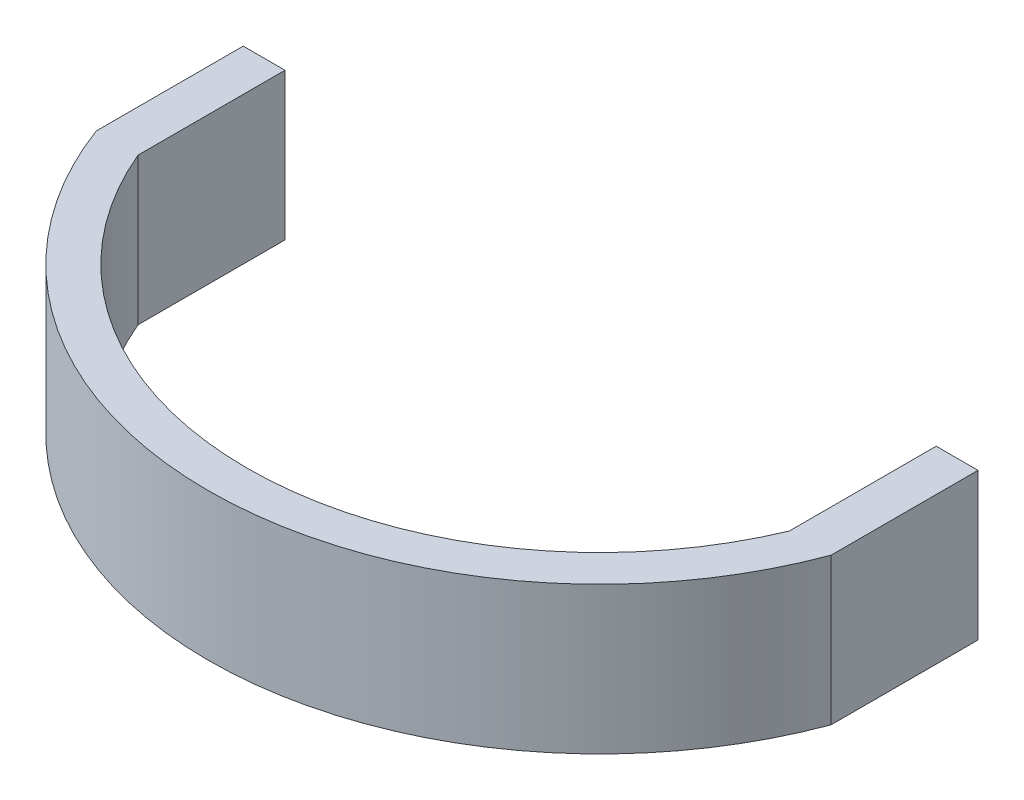
ISO-10303-21;
HEADER;
FILE_DESCRIPTION(('STEP AP214'),'2;1');
FILE_NAME('part.step','',(''),(''),'','','');
FILE_SCHEMA(('AUTOMOTIVE_DESIGN { 1 0 10303 214 1 1 1 1 }'));
ENDSEC;
DATA;
#1=APPLICATION_CONTEXT('core data for automotive mechanical design processes');
#2=APPLICATION_PROTOCOL_DEFINITION('international standard','automotive_design',2000,#1);
#3=PRODUCT_CONTEXT('',#1,'mechanical');
#4=PRODUCT('Part','Part','',(#3));
#5=PRODUCT_RELATED_PRODUCT_CATEGORY('part','',(#4));
#6=PRODUCT_DEFINITION_FORMATION('','',#4);
#7=PRODUCT_DEFINITION_CONTEXT('part definition',#1,'design');
#8=PRODUCT_DEFINITION('design','',#6,#7);
#9=PRODUCT_DEFINITION_SHAPE('','',#8);
#10=(LENGTH_UNIT() NAMED_UNIT(*) SI_UNIT(.MILLI.,.METRE.));
#11=(NAMED_UNIT(*) PLANE_ANGLE_UNIT() SI_UNIT($,.RADIAN.));
#12=(NAMED_UNIT(*) SI_UNIT($,.STERADIAN.) SOLID_ANGLE_UNIT());
#13=UNCERTAINTY_MEASURE_WITH_UNIT(LENGTH_MEASURE(1.E-05),#10,'distance_accuracy_value','');
#14=(GEOMETRIC_REPRESENTATION_CONTEXT(3) GLOBAL_UNCERTAINTY_ASSIGNED_CONTEXT((#13)) GLOBAL_UNIT_ASSIGNED_CONTEXT((#10,
#11,#12)) REPRESENTATION_CONTEXT('',''));
#15=CARTESIAN_POINT('',(0.,0.,0.));
#16=DIRECTION('',(0.,0.,1.));
#17=DIRECTION('',(1.,0.,0.));
#18=AXIS2_PLACEMENT_3D('',#15,#16,#17);
#19=CARTESIAN_POINT('',(0.,1.5,0.));
#20=DIRECTION('',(0.,-1.,0.));
#21=DIRECTION('',(0.,0.,-1.));
#22=AXIS2_PLACEMENT_3D('',#19,#20,#21);
#23=CYLINDRICAL_SURFACE('',#22,8.);
#24=CARTESIAN_POINT('',(0.,-1.5,0.));
#25=DIRECTION('',(0.,1.,0.));
#26=DIRECTION('',(0.,0.,1.));
#27=AXIS2_PLACEMENT_3D('',#24,#25,#26);
#28=CIRCLE('',#27,8.);
#29=CARTESIAN_POINT('',(-7.5,-1.5,2.78388218141501));
#30=VERTEX_POINT('',#29);
#31=CARTESIAN_POINT('',(7.5,-1.5,2.78388218141501));
#32=VERTEX_POINT('',#31);
#33=EDGE_CURVE('E140',#30,#32,#28,.T.);
#34=ORIENTED_EDGE('',*,*,#33,.T.);
#35=DIRECTION('',(0.,-1.,0.));
#36=VECTOR('',#35,1.);
#37=CARTESIAN_POINT('',(7.5,1.5,2.78388218141501));
#38=LINE('',#37,#36);
#39=CARTESIAN_POINT('',(7.5,1.5,2.78388218141501));
#40=VERTEX_POINT('',#39);
#41=EDGE_CURVE('E11',#40,#32,#38,.T.);
#42=ORIENTED_EDGE('',*,*,#41,.F.);
#43=CARTESIAN_POINT('',(0.,1.5,0.));
#44=DIRECTION('',(0.,1.,0.));
#45=DIRECTION('',(0.,0.,1.));
#46=AXIS2_PLACEMENT_3D('',#43,#44,#45);
#47=CIRCLE('',#46,8.);
#48=CARTESIAN_POINT('',(-7.5,1.5,2.78388218141501));
#49=VERTEX_POINT('',#48);
#50=EDGE_CURVE('E162',#49,#40,#47,.T.);
#51=ORIENTED_EDGE('',*,*,#50,.F.);
#52=DIRECTION('',(0.,-1.,0.));
#53=VECTOR('',#52,1.);
#54=CARTESIAN_POINT('',(-7.5,1.5,2.78388218141501));
#55=LINE('',#54,#53);
#56=EDGE_CURVE('E136',#49,#30,#55,.T.);
#57=ORIENTED_EDGE('',*,*,#56,.T.);
#58=EDGE_LOOP('',(#34,#42,#51,#57));
#59=FACE_BOUND('',#58,.T.);
#60=ADVANCED_FACE('F39',(#59),#23,.T.);
#61=CARTESIAN_POINT('',(7.5,1.5,-0.216117818584991));
#62=DIRECTION('',(-1.,0.,0.));
#63=DIRECTION('',(0.,0.,1.));
#64=AXIS2_PLACEMENT_3D('',#61,#62,#63);
#65=PLANE('',#64);
#66=DIRECTION('',(0.,0.,-1.));
#67=VECTOR('',#66,1.);
#68=CARTESIAN_POINT('',(7.5,-1.5,-0.216117818584991));
#69=LINE('',#68,#67);
#70=CARTESIAN_POINT('',(7.5,-1.5,-0.216117818584991));
#71=VERTEX_POINT('',#70);
#72=EDGE_CURVE('E144',#32,#71,#69,.T.);
#73=ORIENTED_EDGE('',*,*,#72,.T.);
#74=DIRECTION('',(0.,-1.,0.));
#75=VECTOR('',#74,1.);
#76=CARTESIAN_POINT('',(7.5,1.5,-0.216117818584991));
#77=LINE('',#76,#75);
#78=CARTESIAN_POINT('',(7.5,1.5,-0.216117818584991));
#79=VERTEX_POINT('',#78);
#80=EDGE_CURVE('E48',#79,#71,#77,.T.);
#81=ORIENTED_EDGE('',*,*,#80,.F.);
#82=DIRECTION('',(0.,0.,-1.));
#83=VECTOR('',#82,1.);
#84=CARTESIAN_POINT('',(7.5,1.5,-0.216117818584991));
#85=LINE('',#84,#83);
#86=EDGE_CURVE('E99',#40,#79,#85,.T.);
#87=ORIENTED_EDGE('',*,*,#86,.F.);
#88=ORIENTED_EDGE('',*,*,#41,.T.);
#89=EDGE_LOOP('',(#73,#81,#87,#88));
#90=FACE_BOUND('',#89,.T.);
#91=ADVANCED_FACE('F208',(#90),#65,.F.);
#92=CARTESIAN_POINT('',(6.64680668159531,1.5,-0.216117818584991));
#93=DIRECTION('',(0.,0.,1.));
#94=DIRECTION('',(1.,0.,0.));
#95=AXIS2_PLACEMENT_3D('',#92,#93,#94);
#96=PLANE('',#95);
#97=DIRECTION('',(-1.,0.,0.));
#98=VECTOR('',#97,1.);
#99=CARTESIAN_POINT('',(6.64680668159531,-1.5,-0.216117818584991));
#100=LINE('',#99,#98);
#101=CARTESIAN_POINT('',(6.64680668159531,-1.5,-0.216117818584991));
#102=VERTEX_POINT('',#101);
#103=EDGE_CURVE('E147',#71,#102,#100,.T.);
#104=ORIENTED_EDGE('',*,*,#103,.T.);
#105=DIRECTION('',(0.,-1.,0.));
#106=VECTOR('',#105,1.);
#107=CARTESIAN_POINT('',(6.64680668159531,1.5,-0.216117818584991));
#108=LINE('',#107,#106);
#109=CARTESIAN_POINT('',(6.64680668159531,1.5,-0.216117818584991));
#110=VERTEX_POINT('',#109);
#111=EDGE_CURVE('E173',#110,#102,#108,.T.);
#112=ORIENTED_EDGE('',*,*,#111,.F.);
#113=DIRECTION('',(-1.,0.,0.));
#114=VECTOR('',#113,1.);
#115=CARTESIAN_POINT('',(6.64680668159531,1.5,-0.216117818584991));
#116=LINE('',#115,#114);
#117=EDGE_CURVE('E183',#79,#110,#116,.T.);
#118=ORIENTED_EDGE('',*,*,#117,.F.);
#119=ORIENTED_EDGE('',*,*,#80,.T.);
#120=EDGE_LOOP('',(#104,#112,#118,#119));
#121=FACE_BOUND('',#120,.T.);
#122=ADVANCED_FACE('F181',(#121),#96,.F.);
#123=CARTESIAN_POINT('',(6.64680668159531,1.5,2.78388218141501));
#124=DIRECTION('',(1.,0.,0.));
#125=DIRECTION('',(0.,0.,-1.));
#126=AXIS2_PLACEMENT_3D('',#123,#124,#125);
#127=PLANE('',#126);
#128=DIRECTION('',(0.,0.,1.));
#129=VECTOR('',#128,1.);
#130=CARTESIAN_POINT('',(6.64680668159531,-1.5,2.78388218141501));
#131=LINE('',#130,#129);
#132=CARTESIAN_POINT('',(6.64680668159531,-1.5,2.78388218141501));
#133=VERTEX_POINT('',#132);
#134=EDGE_CURVE('E150',#102,#133,#131,.T.);
#135=ORIENTED_EDGE('',*,*,#134,.T.);
#136=DIRECTION('',(0.,-1.,0.));
#137=VECTOR('',#136,1.);
#138=CARTESIAN_POINT('',(6.64680668159531,1.5,2.78388218141501));
#139=LINE('',#138,#137);
#140=CARTESIAN_POINT('',(6.64680668159531,1.5,2.78388218141501));
#141=VERTEX_POINT('',#140);
#142=EDGE_CURVE('E169',#141,#133,#139,.T.);
#143=ORIENTED_EDGE('',*,*,#142,.F.);
#144=DIRECTION('',(0.,0.,1.));
#145=VECTOR('',#144,1.);
#146=CARTESIAN_POINT('',(6.64680668159531,1.5,2.78388218141501));
#147=LINE('',#146,#145);
#148=EDGE_CURVE('E196',#110,#141,#147,.T.);
#149=ORIENTED_EDGE('',*,*,#148,.F.);
#150=ORIENTED_EDGE('',*,*,#111,.T.);
#151=EDGE_LOOP('',(#135,#143,#149,#150));
#152=FACE_BOUND('',#151,.T.);
#153=ADVANCED_FACE('F191',(#152),#127,.F.);
#154=CARTESIAN_POINT('',(0.,1.5,0.));
#155=DIRECTION('',(0.,-1.,0.));
#156=DIRECTION('',(0.,0.,-1.));
#157=AXIS2_PLACEMENT_3D('',#154,#155,#156);
#158=CYLINDRICAL_SURFACE('',#157,7.20625);
#159=CARTESIAN_POINT('',(0.,-1.5,0.));
#160=DIRECTION('',(0.,-1.,0.));
#161=DIRECTION('',(0.,0.,1.));
#162=AXIS2_PLACEMENT_3D('',#159,#160,#161);
#163=CIRCLE('',#162,7.20625);
#164=CARTESIAN_POINT('',(-6.64680668159531,-1.5,2.78388218141501));
#165=VERTEX_POINT('',#164);
#166=EDGE_CURVE('E153',#133,#165,#163,.T.);
#167=ORIENTED_EDGE('',*,*,#166,.T.);
#168=DIRECTION('',(0.,-1.,0.));
#169=VECTOR('',#168,1.);
#170=CARTESIAN_POINT('',(-6.64680668159531,1.5,2.78388218141501));
#171=LINE('',#170,#169);
#172=CARTESIAN_POINT('',(-6.64680668159531,1.5,2.78388218141501));
#173=VERTEX_POINT('',#172);
#174=EDGE_CURVE('E129',#173,#165,#171,.T.);
#175=ORIENTED_EDGE('',*,*,#174,.F.);
#176=CARTESIAN_POINT('',(0.,1.5,0.));
#177=DIRECTION('',(0.,-1.,0.));
#178=DIRECTION('',(0.,0.,1.));
#179=AXIS2_PLACEMENT_3D('',#176,#177,#178);
#180=CIRCLE('',#179,7.20625);
#181=EDGE_CURVE('E118',#141,#173,#180,.T.);
#182=ORIENTED_EDGE('',*,*,#181,.F.);
#183=ORIENTED_EDGE('',*,*,#142,.T.);
#184=EDGE_LOOP('',(#167,#175,#182,#183));
#185=FACE_BOUND('',#184,.T.);
#186=ADVANCED_FACE('F194',(#185),#158,.F.);
#187=CARTESIAN_POINT('',(-6.64680668159531,1.5,-0.216117818584991));
#188=DIRECTION('',(-1.,0.,0.));
#189=DIRECTION('',(0.,0.,1.));
#190=AXIS2_PLACEMENT_3D('',#187,#188,#189);
#191=PLANE('',#190);
#192=DIRECTION('',(0.,0.,-1.));
#193=VECTOR('',#192,1.);
#194=CARTESIAN_POINT('',(-6.64680668159531,-1.5,-0.216117818584991));
#195=LINE('',#194,#193);
#196=CARTESIAN_POINT('',(-6.64680668159531,-1.5,-0.216117818584991));
#197=VERTEX_POINT('',#196);
#198=EDGE_CURVE('E127',#165,#197,#195,.T.);
#199=ORIENTED_EDGE('',*,*,#198,.T.);
#200=DIRECTION('',(0.,-1.,0.));
#201=VECTOR('',#200,1.);
#202=CARTESIAN_POINT('',(-6.64680668159531,1.5,-0.216117818584991));
#203=LINE('',#202,#201);
#204=CARTESIAN_POINT('',(-6.64680668159531,1.5,-0.216117818584991));
#205=VERTEX_POINT('',#204);
#206=EDGE_CURVE('E124',#205,#197,#203,.T.);
#207=ORIENTED_EDGE('',*,*,#206,.F.);
#208=DIRECTION('',(0.,0.,-1.));
#209=VECTOR('',#208,1.);
#210=CARTESIAN_POINT('',(-6.64680668159531,1.5,-0.216117818584991));
#211=LINE('',#210,#209);
#212=EDGE_CURVE('E112',#173,#205,#211,.T.);
#213=ORIENTED_EDGE('',*,*,#212,.F.);
#214=ORIENTED_EDGE('',*,*,#174,.T.);
#215=EDGE_LOOP('',(#199,#207,#213,#214));
#216=FACE_BOUND('',#215,.T.);
#217=ADVANCED_FACE('F125',(#216),#191,.F.);
#218=CARTESIAN_POINT('',(-7.5,1.5,-0.216117818584986));
#219=DIRECTION('',(0.,0.,1.));
#220=DIRECTION('',(1.,0.,0.));
#221=AXIS2_PLACEMENT_3D('',#218,#219,#220);
#222=PLANE('',#221);
#223=DIRECTION('',(-1.,0.,0.));
#224=VECTOR('',#223,1.);
#225=CARTESIAN_POINT('',(-7.5,-1.5,-0.216117818584986));
#226=LINE('',#225,#224);
#227=CARTESIAN_POINT('',(-7.5,-1.5,-0.216117818584986));
#228=VERTEX_POINT('',#227);
#229=EDGE_CURVE('E85',#197,#228,#226,.T.);
#230=ORIENTED_EDGE('',*,*,#229,.T.);
#231=DIRECTION('',(0.,-1.,0.));
#232=VECTOR('',#231,1.);
#233=CARTESIAN_POINT('',(-7.5,1.5,-0.216117818584986));
#234=LINE('',#233,#232);
#235=CARTESIAN_POINT('',(-7.5,1.5,-0.216117818584986));
#236=VERTEX_POINT('',#235);
#237=EDGE_CURVE('E130',#236,#228,#234,.T.);
#238=ORIENTED_EDGE('',*,*,#237,.F.);
#239=DIRECTION('',(-1.,0.,0.));
#240=VECTOR('',#239,1.);
#241=CARTESIAN_POINT('',(-7.5,1.5,-0.216117818584986));
#242=LINE('',#241,#240);
#243=EDGE_CURVE('E116',#205,#236,#242,.T.);
#244=ORIENTED_EDGE('',*,*,#243,.F.);
#245=ORIENTED_EDGE('',*,*,#206,.T.);
#246=EDGE_LOOP('',(#230,#238,#244,#245));
#247=FACE_BOUND('',#246,.T.);
#248=ADVANCED_FACE('F132',(#247),#222,.F.);
#249=CARTESIAN_POINT('',(-7.5,1.5,2.78388218141501));
#250=DIRECTION('',(1.,0.,0.));
#251=DIRECTION('',(0.,0.,-1.));
#252=AXIS2_PLACEMENT_3D('',#249,#250,#251);
#253=PLANE('',#252);
#254=DIRECTION('',(0.,0.,1.));
#255=VECTOR('',#254,1.);
#256=CARTESIAN_POINT('',(-7.5,-1.5,2.78388218141501));
#257=LINE('',#256,#255);
#258=EDGE_CURVE('E91',#228,#30,#257,.T.);
#259=ORIENTED_EDGE('',*,*,#258,.T.);
#260=ORIENTED_EDGE('',*,*,#56,.F.);
#261=DIRECTION('',(0.,0.,1.));
#262=VECTOR('',#261,1.);
#263=CARTESIAN_POINT('',(-7.5,1.5,2.78388218141501));
#264=LINE('',#263,#262);
#265=EDGE_CURVE('E56',#236,#49,#264,.T.);
#266=ORIENTED_EDGE('',*,*,#265,.F.);
#267=ORIENTED_EDGE('',*,*,#237,.T.);
#268=EDGE_LOOP('',(#259,#260,#266,#267));
#269=FACE_BOUND('',#268,.T.);
#270=ADVANCED_FACE('F224',(#269),#253,.F.);
#271=CARTESIAN_POINT('',(0.,1.5,0.));
#272=DIRECTION('',(0.,1.,0.));
#273=DIRECTION('',(0.,0.,1.));
#274=AXIS2_PLACEMENT_3D('',#271,#272,#273);
#275=PLANE('',#274);
#276=ORIENTED_EDGE('',*,*,#50,.T.);
#277=ORIENTED_EDGE('',*,*,#86,.T.);
#278=ORIENTED_EDGE('',*,*,#117,.T.);
#279=ORIENTED_EDGE('',*,*,#148,.T.);
#280=ORIENTED_EDGE('',*,*,#181,.T.);
#281=ORIENTED_EDGE('',*,*,#212,.T.);
#282=ORIENTED_EDGE('',*,*,#243,.T.);
#283=ORIENTED_EDGE('',*,*,#265,.T.);
#284=EDGE_LOOP('',(#276,#277,#278,#279,#280,#281,#282,#283));
#285=FACE_BOUND('',#284,.T.);
#286=ADVANCED_FACE('F114',(#285),#275,.T.);
#287=CARTESIAN_POINT('',(0.,-1.5,0.));
#288=DIRECTION('',(0.,1.,0.));
#289=DIRECTION('',(0.,0.,1.));
#290=AXIS2_PLACEMENT_3D('',#287,#288,#289);
#291=PLANE('',#290);
#292=ORIENTED_EDGE('',*,*,#33,.F.);
#293=ORIENTED_EDGE('',*,*,#258,.F.);
#294=ORIENTED_EDGE('',*,*,#229,.F.);
#295=ORIENTED_EDGE('',*,*,#198,.F.);
#296=ORIENTED_EDGE('',*,*,#166,.F.);
#297=ORIENTED_EDGE('',*,*,#134,.F.);
#298=ORIENTED_EDGE('',*,*,#103,.F.);
#299=ORIENTED_EDGE('',*,*,#72,.F.);
#300=EDGE_LOOP('',(#292,#293,#294,#295,#296,#297,#298,#299));
#301=FACE_BOUND('',#300,.T.);
#302=ADVANCED_FACE('F187',(#301),#291,.F.);
#303=CLOSED_SHELL('',(#60,#91,#122,#153,#186,#217,#248,#270,#286,#302));
#304=MANIFOLD_SOLID_BREP('B2',#303);
#305=ADVANCED_BREP_SHAPE_REPRESENTATION('',(#18,#304),#14);
#306=SHAPE_DEFINITION_REPRESENTATION(#9,#305);
ENDSEC;
END-ISO-10303-21;
